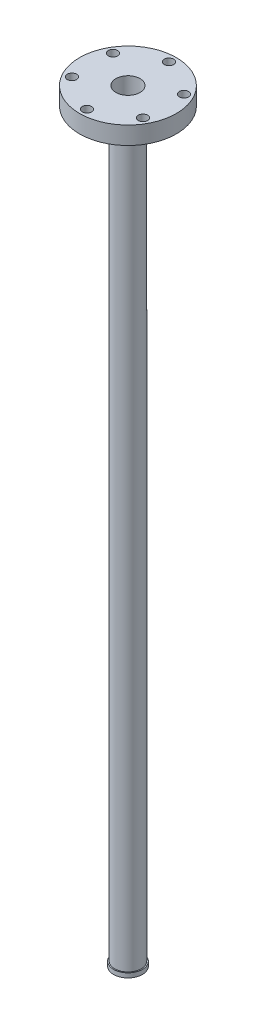
ISO-10303-21;
HEADER;
FILE_DESCRIPTION(('STEP AP214'),'2;1');
FILE_NAME('part.step','',(''),(''),'','','');
FILE_SCHEMA(('AUTOMOTIVE_DESIGN { 1 0 10303 214 1 1 1 1 }'));
ENDSEC;
DATA;
#1=APPLICATION_CONTEXT('core data for automotive mechanical design processes');
#2=APPLICATION_PROTOCOL_DEFINITION('international standard','automotive_design',2000,#1);
#3=PRODUCT_CONTEXT('',#1,'mechanical');
#4=PRODUCT('Part','Part','',(#3));
#5=PRODUCT_RELATED_PRODUCT_CATEGORY('part','',(#4));
#6=PRODUCT_DEFINITION_FORMATION('','',#4);
#7=PRODUCT_DEFINITION_CONTEXT('part definition',#1,'design');
#8=PRODUCT_DEFINITION('design','',#6,#7);
#9=PRODUCT_DEFINITION_SHAPE('','',#8);
#10=(LENGTH_UNIT() NAMED_UNIT(*) SI_UNIT(.MILLI.,.METRE.));
#11=(NAMED_UNIT(*) PLANE_ANGLE_UNIT() SI_UNIT($,.RADIAN.));
#12=(NAMED_UNIT(*) SI_UNIT($,.STERADIAN.) SOLID_ANGLE_UNIT());
#13=UNCERTAINTY_MEASURE_WITH_UNIT(LENGTH_MEASURE(1.E-05),#10,'distance_accuracy_value','');
#14=(GEOMETRIC_REPRESENTATION_CONTEXT(3) GLOBAL_UNCERTAINTY_ASSIGNED_CONTEXT((#13)) GLOBAL_UNIT_ASSIGNED_CONTEXT((#10,
#11,#12)) REPRESENTATION_CONTEXT('',''));
#15=CARTESIAN_POINT('',(0.,0.,0.));
#16=DIRECTION('',(0.,0.,1.));
#17=DIRECTION('',(1.,0.,0.));
#18=AXIS2_PLACEMENT_3D('',#15,#16,#17);
#19=CARTESIAN_POINT('',(0.,546.1,-2.22044604925031E-13));
#20=DIRECTION('',(0.,-1.,0.));
#21=DIRECTION('',(0.,0.,-1.));
#22=AXIS2_PLACEMENT_3D('',#19,#20,#21);
#23=CYLINDRICAL_SURFACE('',#22,9.525);
#24=CARTESIAN_POINT('',(0.,533.4,-2.22044604925031E-13));
#25=DIRECTION('',(0.,1.,0.));
#26=DIRECTION('',(0.,0.,1.));
#27=AXIS2_PLACEMENT_3D('',#24,#25,#26);
#28=CIRCLE('',#27,9.525);
#29=CARTESIAN_POINT('',(0.,533.4,9.52499999999978));
#30=VERTEX_POINT('',#29);
#31=EDGE_CURVE('E38',#30,#30,#28,.T.);
#32=ORIENTED_EDGE('',*,*,#31,.F.);
#33=EDGE_LOOP('',(#32));
#34=FACE_BOUND('',#33,.T.);
#35=CARTESIAN_POINT('',(0.,3.17500000000004,0.));
#36=DIRECTION('',(0.,-1.,0.));
#37=DIRECTION('',(0.,0.,-1.));
#38=AXIS2_PLACEMENT_3D('',#35,#36,#37);
#39=CIRCLE('',#38,9.525);
#40=CARTESIAN_POINT('',(0.,3.17500000000004,-9.525));
#41=VERTEX_POINT('',#40);
#42=EDGE_CURVE('E10',#41,#41,#39,.T.);
#43=ORIENTED_EDGE('',*,*,#42,.F.);
#44=EDGE_LOOP('',(#43));
#45=FACE_BOUND('',#44,.T.);
#46=ADVANCED_FACE('F31',(#34,#45),#23,.T.);
#47=CARTESIAN_POINT('',(0.,546.1,-2.22044604925031E-13));
#48=DIRECTION('',(0.,1.,0.));
#49=DIRECTION('',(0.,0.,1.));
#50=AXIS2_PLACEMENT_3D('',#47,#48,#49);
#51=PLANE('',#50);
#52=CARTESIAN_POINT('',(-25.42858431608,546.1,-14.6812000000018));
#53=DIRECTION('',(0.,1.,0.));
#54=DIRECTION('',(0.866025403784432,0.,0.50000000000001));
#55=AXIS2_PLACEMENT_3D('',#52,#53,#54);
#56=CIRCLE('',#55,3.3655);
#57=CARTESIAN_POINT('',(-22.5139758196435,546.1,-12.9984500000018));
#58=VERTEX_POINT('',#57);
#59=EDGE_CURVE('E49',#58,#58,#56,.T.);
#60=ORIENTED_EDGE('',*,*,#59,.F.);
#61=EDGE_LOOP('',(#60));
#62=FACE_BOUND('',#61,.T.);
#63=CARTESIAN_POINT('',(-25.4285843160802,546.1,14.6811999999985));
#64=DIRECTION('',(0.,1.,0.));
#65=DIRECTION('',(0.866025403784443,0.,-0.499999999999992));
#66=AXIS2_PLACEMENT_3D('',#63,#64,#65);
#67=CIRCLE('',#66,3.3655);
#68=CARTESIAN_POINT('',(-22.5139758196437,546.1,12.9984499999985));
#69=VERTEX_POINT('',#68);
#70=EDGE_CURVE('E53',#69,#69,#67,.T.);
#71=ORIENTED_EDGE('',*,*,#70,.F.);
#72=EDGE_LOOP('',(#71));
#73=FACE_BOUND('',#72,.T.);
#74=CARTESIAN_POINT('',(0.,546.1,29.362399999997));
#75=DIRECTION('',(0.,1.,0.));
#76=DIRECTION('',(0.,0.,-0.999999999999999));
#77=AXIS2_PLACEMENT_3D('',#74,#75,#76);
#78=CIRCLE('',#77,3.3655);
#79=CARTESIAN_POINT('',(0.,546.1,25.996899999997));
#80=VERTEX_POINT('',#79);
#81=EDGE_CURVE('E57',#80,#80,#78,.T.);
#82=ORIENTED_EDGE('',*,*,#81,.F.);
#83=EDGE_LOOP('',(#82));
#84=FACE_BOUND('',#83,.T.);
#85=CARTESIAN_POINT('',(25.4285843160803,546.1,14.6811999999981));
#86=DIRECTION('',(0.,1.,0.));
#87=DIRECTION('',(-0.866025403784437,0.,-0.500000000000004));
#88=AXIS2_PLACEMENT_3D('',#85,#86,#87);
#89=CIRCLE('',#88,3.3655);
#90=CARTESIAN_POINT('',(22.5139758196438,546.1,12.998449999998));
#91=VERTEX_POINT('',#90);
#92=EDGE_CURVE('E61',#91,#91,#89,.T.);
#93=ORIENTED_EDGE('',*,*,#92,.F.);
#94=EDGE_LOOP('',(#93));
#95=FACE_BOUND('',#94,.T.);
#96=CARTESIAN_POINT('',(25.4285843160802,546.1,-14.6812000000018));
#97=DIRECTION('',(0.,1.,0.));
#98=DIRECTION('',(-0.86602540378444,0.,0.499999999999998));
#99=AXIS2_PLACEMENT_3D('',#96,#97,#98);
#100=CIRCLE('',#99,3.3655);
#101=CARTESIAN_POINT('',(22.5139758196437,546.1,-12.9984500000018));
#102=VERTEX_POINT('',#101);
#103=EDGE_CURVE('E65',#102,#102,#100,.T.);
#104=ORIENTED_EDGE('',*,*,#103,.F.);
#105=EDGE_LOOP('',(#104));
#106=FACE_BOUND('',#105,.T.);
#107=CARTESIAN_POINT('',(3.33066907387547E-13,546.1,-29.3624000000023));
#108=DIRECTION('',(0.,1.,0.));
#109=DIRECTION('',(0.,0.,1.));
#110=AXIS2_PLACEMENT_3D('',#107,#108,#109);
#111=CIRCLE('',#110,3.3655);
#112=CARTESIAN_POINT('',(3.33066907387547E-13,546.1,-25.9969000000023));
#113=VERTEX_POINT('',#112);
#114=EDGE_CURVE('E69',#113,#113,#111,.T.);
#115=ORIENTED_EDGE('',*,*,#114,.F.);
#116=EDGE_LOOP('',(#115));
#117=FACE_BOUND('',#116,.T.);
#118=CARTESIAN_POINT('',(0.,546.1,-2.22044604925031E-13));
#119=DIRECTION('',(0.,1.,0.));
#120=DIRECTION('',(0.,0.,1.));
#121=AXIS2_PLACEMENT_3D('',#118,#119,#120);
#122=CIRCLE('',#121,8.636);
#123=CARTESIAN_POINT('',(0.,546.1,8.63599999999978));
#124=VERTEX_POINT('',#123);
#125=EDGE_CURVE('E43',#124,#124,#122,.T.);
#126=ORIENTED_EDGE('',*,*,#125,.F.);
#127=EDGE_LOOP('',(#126));
#128=FACE_BOUND('',#127,.T.);
#129=CARTESIAN_POINT('',(0.,546.1,-2.22044604925031E-13));
#130=DIRECTION('',(0.,1.,0.));
#131=DIRECTION('',(0.,0.,1.));
#132=AXIS2_PLACEMENT_3D('',#129,#130,#131);
#133=CIRCLE('',#132,34.671);
#134=CARTESIAN_POINT('',(0.,546.1,34.6709999999998));
#135=VERTEX_POINT('',#134);
#136=EDGE_CURVE('E77',#135,#135,#133,.T.);
#137=ORIENTED_EDGE('',*,*,#136,.T.);
#138=EDGE_LOOP('',(#137));
#139=FACE_BOUND('',#138,.T.);
#140=ADVANCED_FACE('F114',(#62,#73,#84,#95,#106,#117,#128,#139),#51,.T.);
#141=CARTESIAN_POINT('',(0.,0.,0.));
#142=DIRECTION('',(0.,1.,0.));
#143=DIRECTION('',(0.,0.,1.));
#144=AXIS2_PLACEMENT_3D('',#141,#142,#143);
#145=PLANE('',#144);
#146=CARTESIAN_POINT('',(0.,0.,0.));
#147=DIRECTION('',(0.,1.,0.));
#148=DIRECTION('',(0.,0.,1.));
#149=AXIS2_PLACEMENT_3D('',#146,#147,#148);
#150=CIRCLE('',#149,8.636);
#151=CARTESIAN_POINT('',(0.,0.,8.636));
#152=VERTEX_POINT('',#151);
#153=EDGE_CURVE('E76',#152,#152,#150,.T.);
#154=ORIENTED_EDGE('',*,*,#153,.T.);
#155=EDGE_LOOP('',(#154));
#156=FACE_BOUND('',#155,.T.);
#157=CARTESIAN_POINT('',(0.,0.,0.));
#158=DIRECTION('',(0.,-1.,0.));
#159=DIRECTION('',(0.,0.,-1.));
#160=AXIS2_PLACEMENT_3D('',#157,#158,#159);
#161=CIRCLE('',#160,10.31875);
#162=CARTESIAN_POINT('',(0.,0.,-10.31875));
#163=VERTEX_POINT('',#162);
#164=EDGE_CURVE('E47',#163,#163,#161,.T.);
#165=ORIENTED_EDGE('',*,*,#164,.T.);
#166=EDGE_LOOP('',(#165));
#167=FACE_BOUND('',#166,.T.);
#168=ADVANCED_FACE('F119',(#156,#167),#145,.F.);
#169=CARTESIAN_POINT('',(0.,546.1,-2.22044604925031E-13));
#170=DIRECTION('',(0.,-1.,0.));
#171=DIRECTION('',(0.,0.,-1.));
#172=AXIS2_PLACEMENT_3D('',#169,#170,#171);
#173=CYLINDRICAL_SURFACE('',#172,8.636);
#174=ORIENTED_EDGE('',*,*,#153,.F.);
#175=EDGE_LOOP('',(#174));
#176=FACE_BOUND('',#175,.T.);
#177=ORIENTED_EDGE('',*,*,#125,.T.);
#178=EDGE_LOOP('',(#177));
#179=FACE_BOUND('',#178,.T.);
#180=ADVANCED_FACE('F127',(#176,#179),#173,.F.);
#181=CARTESIAN_POINT('',(0.,533.4,-2.22044604925031E-13));
#182=DIRECTION('',(0.,1.,0.));
#183=DIRECTION('',(0.,0.,1.));
#184=AXIS2_PLACEMENT_3D('',#181,#182,#183);
#185=PLANE('',#184);
#186=CARTESIAN_POINT('',(-25.42858431608,533.4,-14.6812000000018));
#187=DIRECTION('',(0.,1.,0.));
#188=DIRECTION('',(0.,0.,1.));
#189=AXIS2_PLACEMENT_3D('',#186,#187,#188);
#190=CIRCLE('',#189,3.3655);
#191=CARTESIAN_POINT('',(-25.42858431608,533.4,-11.3157000000018));
#192=VERTEX_POINT('',#191);
#193=EDGE_CURVE('E34',#192,#192,#190,.T.);
#194=ORIENTED_EDGE('',*,*,#193,.T.);
#195=EDGE_LOOP('',(#194));
#196=FACE_BOUND('',#195,.T.);
#197=CARTESIAN_POINT('',(-25.4285843160803,533.4,14.6811999999985));
#198=DIRECTION('',(0.,1.,0.));
#199=DIRECTION('',(0.,0.,1.));
#200=AXIS2_PLACEMENT_3D('',#197,#198,#199);
#201=CIRCLE('',#200,3.3655);
#202=CARTESIAN_POINT('',(-25.4285843160803,533.4,18.0466999999985));
#203=VERTEX_POINT('',#202);
#204=EDGE_CURVE('E56',#203,#203,#201,.T.);
#205=ORIENTED_EDGE('',*,*,#204,.T.);
#206=EDGE_LOOP('',(#205));
#207=FACE_BOUND('',#206,.T.);
#208=CARTESIAN_POINT('',(0.,533.4,29.362399999997));
#209=DIRECTION('',(0.,1.,0.));
#210=DIRECTION('',(0.,0.,1.));
#211=AXIS2_PLACEMENT_3D('',#208,#209,#210);
#212=CIRCLE('',#211,3.3655);
#213=CARTESIAN_POINT('',(0.,533.4,32.727899999997));
#214=VERTEX_POINT('',#213);
#215=EDGE_CURVE('E60',#214,#214,#212,.T.);
#216=ORIENTED_EDGE('',*,*,#215,.T.);
#217=EDGE_LOOP('',(#216));
#218=FACE_BOUND('',#217,.T.);
#219=CARTESIAN_POINT('',(25.4285843160803,533.4,14.6811999999981));
#220=DIRECTION('',(0.,1.,0.));
#221=DIRECTION('',(0.,0.,1.));
#222=AXIS2_PLACEMENT_3D('',#219,#220,#221);
#223=CIRCLE('',#222,3.3655);
#224=CARTESIAN_POINT('',(25.4285843160803,533.4,18.0466999999981));
#225=VERTEX_POINT('',#224);
#226=EDGE_CURVE('E64',#225,#225,#223,.T.);
#227=ORIENTED_EDGE('',*,*,#226,.T.);
#228=EDGE_LOOP('',(#227));
#229=FACE_BOUND('',#228,.T.);
#230=CARTESIAN_POINT('',(25.4285843160802,533.4,-14.6812000000018));
#231=DIRECTION('',(0.,1.,0.));
#232=DIRECTION('',(0.,0.,1.));
#233=AXIS2_PLACEMENT_3D('',#230,#231,#232);
#234=CIRCLE('',#233,3.3655);
#235=CARTESIAN_POINT('',(25.4285843160802,533.4,-11.3157000000018));
#236=VERTEX_POINT('',#235);
#237=EDGE_CURVE('E68',#236,#236,#234,.T.);
#238=ORIENTED_EDGE('',*,*,#237,.T.);
#239=EDGE_LOOP('',(#238));
#240=FACE_BOUND('',#239,.T.);
#241=CARTESIAN_POINT('',(3.33066907387547E-13,533.4,-29.3624000000023));
#242=DIRECTION('',(0.,1.,0.));
#243=DIRECTION('',(0.,0.,1.));
#244=AXIS2_PLACEMENT_3D('',#241,#242,#243);
#245=CIRCLE('',#244,3.3655);
#246=CARTESIAN_POINT('',(3.33066907387547E-13,533.4,-25.9969000000023));
#247=VERTEX_POINT('',#246);
#248=EDGE_CURVE('E72',#247,#247,#245,.T.);
#249=ORIENTED_EDGE('',*,*,#248,.T.);
#250=EDGE_LOOP('',(#249));
#251=FACE_BOUND('',#250,.T.);
#252=CARTESIAN_POINT('',(0.,533.4,-2.22044604925031E-13));
#253=DIRECTION('',(0.,1.,0.));
#254=DIRECTION('',(0.,0.,1.));
#255=AXIS2_PLACEMENT_3D('',#252,#253,#254);
#256=CIRCLE('',#255,34.671);
#257=CARTESIAN_POINT('',(0.,533.4,34.6709999999998));
#258=VERTEX_POINT('',#257);
#259=EDGE_CURVE('E73',#258,#258,#256,.T.);
#260=ORIENTED_EDGE('',*,*,#259,.F.);
#261=EDGE_LOOP('',(#260));
#262=FACE_BOUND('',#261,.T.);
#263=ORIENTED_EDGE('',*,*,#31,.T.);
#264=EDGE_LOOP('',(#263));
#265=FACE_BOUND('',#264,.T.);
#266=ADVANCED_FACE('F94',(#196,#207,#218,#229,#240,#251,#262,#265),#185,.F.);
#267=CARTESIAN_POINT('',(0.,533.4,-2.22044604925031E-13));
#268=DIRECTION('',(0.,1.,0.));
#269=DIRECTION('',(0.,0.,1.));
#270=AXIS2_PLACEMENT_3D('',#267,#268,#269);
#271=CYLINDRICAL_SURFACE('',#270,34.671);
#272=ORIENTED_EDGE('',*,*,#259,.T.);
#273=EDGE_LOOP('',(#272));
#274=FACE_BOUND('',#273,.T.);
#275=ORIENTED_EDGE('',*,*,#136,.F.);
#276=EDGE_LOOP('',(#275));
#277=FACE_BOUND('',#276,.T.);
#278=ADVANCED_FACE('F126',(#274,#277),#271,.T.);
#279=CARTESIAN_POINT('',(1.22124532708767E-12,0.,-29.3624000000015));
#280=DIRECTION('',(0.,1.,0.));
#281=DIRECTION('',(0.,0.,1.));
#282=AXIS2_PLACEMENT_3D('',#279,#280,#281);
#283=CYLINDRICAL_SURFACE('',#282,3.3655);
#284=ORIENTED_EDGE('',*,*,#114,.T.);
#285=EDGE_LOOP('',(#284));
#286=FACE_BOUND('',#285,.T.);
#287=ORIENTED_EDGE('',*,*,#248,.F.);
#288=EDGE_LOOP('',(#287));
#289=FACE_BOUND('',#288,.T.);
#290=ADVANCED_FACE('F134',(#286,#289),#283,.F.);
#291=CARTESIAN_POINT('',(25.4285843160816,0.,-14.6812000000005));
#292=DIRECTION('',(0.,1.,0.));
#293=DIRECTION('',(0.,0.,1.));
#294=AXIS2_PLACEMENT_3D('',#291,#292,#293);
#295=CYLINDRICAL_SURFACE('',#294,3.3655);
#296=ORIENTED_EDGE('',*,*,#103,.T.);
#297=EDGE_LOOP('',(#296));
#298=FACE_BOUND('',#297,.T.);
#299=ORIENTED_EDGE('',*,*,#237,.F.);
#300=EDGE_LOOP('',(#299));
#301=FACE_BOUND('',#300,.T.);
#302=ADVANCED_FACE('F192',(#298,#301),#295,.F.);
#303=CARTESIAN_POINT('',(25.4285843160812,0.,14.6811999999985));
#304=DIRECTION('',(0.,1.,0.));
#305=DIRECTION('',(0.,0.,1.));
#306=AXIS2_PLACEMENT_3D('',#303,#304,#305);
#307=CYLINDRICAL_SURFACE('',#306,3.3655);
#308=ORIENTED_EDGE('',*,*,#92,.T.);
#309=EDGE_LOOP('',(#308));
#310=FACE_BOUND('',#309,.T.);
#311=ORIENTED_EDGE('',*,*,#226,.F.);
#312=EDGE_LOOP('',(#311));
#313=FACE_BOUND('',#312,.T.);
#314=ADVANCED_FACE('F110',(#310,#313),#307,.F.);
#315=CARTESIAN_POINT('',(7.7715611723761E-13,0.,29.3623999999979));
#316=DIRECTION('',(0.,1.,0.));
#317=DIRECTION('',(0.,0.,1.));
#318=AXIS2_PLACEMENT_3D('',#315,#316,#317);
#319=CYLINDRICAL_SURFACE('',#318,3.3655);
#320=ORIENTED_EDGE('',*,*,#81,.T.);
#321=EDGE_LOOP('',(#320));
#322=FACE_BOUND('',#321,.T.);
#323=ORIENTED_EDGE('',*,*,#215,.F.);
#324=EDGE_LOOP('',(#323));
#325=FACE_BOUND('',#324,.T.);
#326=ADVANCED_FACE('F100',(#322,#325),#319,.F.);
#327=CARTESIAN_POINT('',(-25.4285843160797,0.,14.6811999999992));
#328=DIRECTION('',(0.,1.,0.));
#329=DIRECTION('',(0.,0.,1.));
#330=AXIS2_PLACEMENT_3D('',#327,#328,#329);
#331=CYLINDRICAL_SURFACE('',#330,3.3655);
#332=ORIENTED_EDGE('',*,*,#70,.T.);
#333=EDGE_LOOP('',(#332));
#334=FACE_BOUND('',#333,.T.);
#335=ORIENTED_EDGE('',*,*,#204,.F.);
#336=EDGE_LOOP('',(#335));
#337=FACE_BOUND('',#336,.T.);
#338=ADVANCED_FACE('F97',(#334,#337),#331,.F.);
#339=CARTESIAN_POINT('',(-25.428584316079,0.,-14.6812000000021));
#340=DIRECTION('',(0.,1.,0.));
#341=DIRECTION('',(0.,0.,1.));
#342=AXIS2_PLACEMENT_3D('',#339,#340,#341);
#343=CYLINDRICAL_SURFACE('',#342,3.3655);
#344=ORIENTED_EDGE('',*,*,#59,.T.);
#345=EDGE_LOOP('',(#344));
#346=FACE_BOUND('',#345,.T.);
#347=ORIENTED_EDGE('',*,*,#193,.F.);
#348=EDGE_LOOP('',(#347));
#349=FACE_BOUND('',#348,.T.);
#350=ADVANCED_FACE('F99',(#346,#349),#343,.F.);
#351=CARTESIAN_POINT('',(0.,3.175,0.));
#352=DIRECTION('',(0.,-1.,0.));
#353=DIRECTION('',(0.,0.,-1.));
#354=AXIS2_PLACEMENT_3D('',#351,#352,#353);
#355=PLANE('',#354);
#356=CARTESIAN_POINT('',(0.,3.175,0.));
#357=DIRECTION('',(0.,-1.,0.));
#358=DIRECTION('',(0.,0.,-1.));
#359=AXIS2_PLACEMENT_3D('',#356,#357,#358);
#360=CIRCLE('',#359,10.31875);
#361=CARTESIAN_POINT('',(0.,3.175,-10.31875));
#362=VERTEX_POINT('',#361);
#363=EDGE_CURVE('E52',#362,#362,#360,.T.);
#364=ORIENTED_EDGE('',*,*,#363,.F.);
#365=EDGE_LOOP('',(#364));
#366=FACE_BOUND('',#365,.T.);
#367=ORIENTED_EDGE('',*,*,#42,.T.);
#368=EDGE_LOOP('',(#367));
#369=FACE_BOUND('',#368,.T.);
#370=ADVANCED_FACE('F107',(#366,#369),#355,.F.);
#371=CARTESIAN_POINT('',(0.,3.175,0.));
#372=DIRECTION('',(0.,-1.,0.));
#373=DIRECTION('',(0.,0.,-1.));
#374=AXIS2_PLACEMENT_3D('',#371,#372,#373);
#375=CYLINDRICAL_SURFACE('',#374,10.31875);
#376=ORIENTED_EDGE('',*,*,#363,.T.);
#377=EDGE_LOOP('',(#376));
#378=FACE_BOUND('',#377,.T.);
#379=ORIENTED_EDGE('',*,*,#164,.F.);
#380=EDGE_LOOP('',(#379));
#381=FACE_BOUND('',#380,.T.);
#382=ADVANCED_FACE('F154',(#378,#381),#375,.T.);
#383=CLOSED_SHELL('',(#46,#140,#168,#180,#266,#278,#290,#302,#314,#326,#338,#350,#370,#382));
#384=MANIFOLD_SOLID_BREP('B2',#383);
#385=ADVANCED_BREP_SHAPE_REPRESENTATION('',(#18,#384),#14);
#386=SHAPE_DEFINITION_REPRESENTATION(#9,#385);
ENDSEC;
END-ISO-10303-21;
